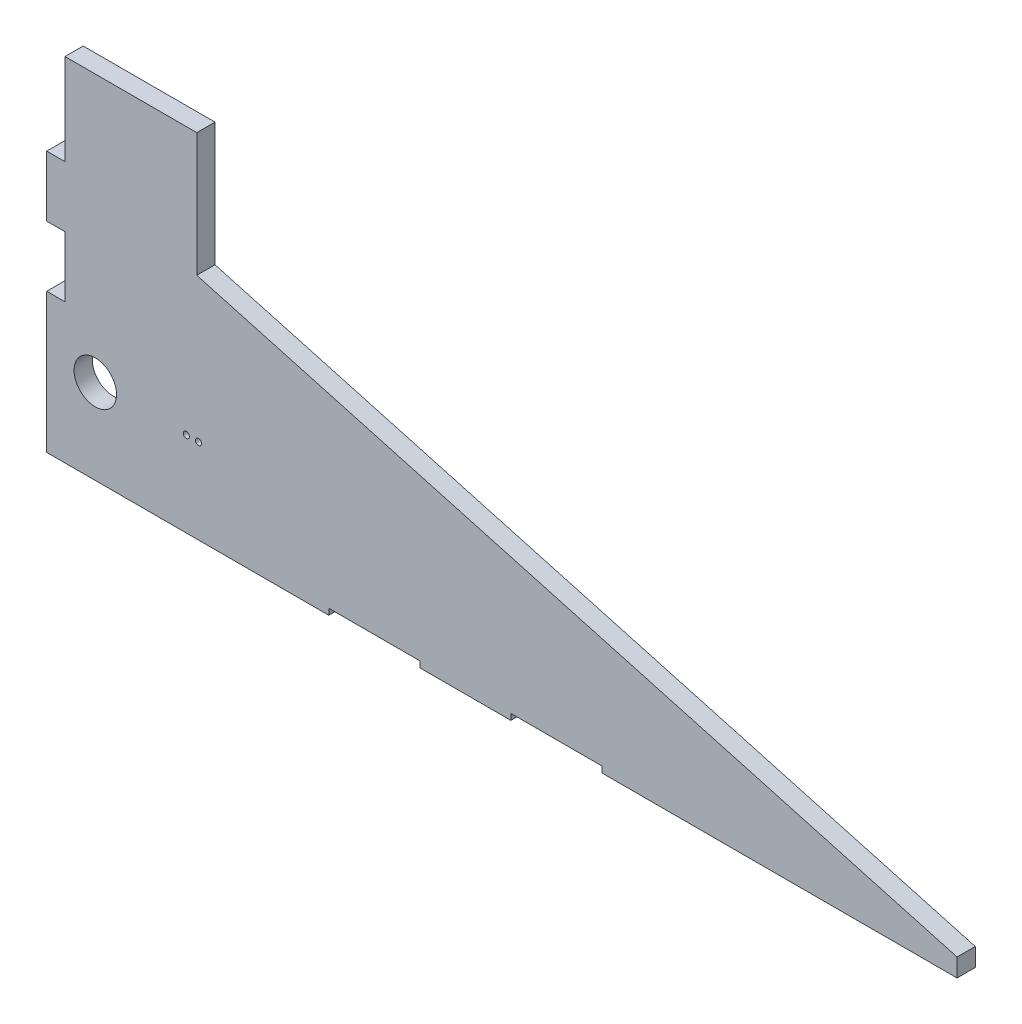
ISO-10303-21;
HEADER;
FILE_DESCRIPTION(('STEP AP214'),'2;1');
FILE_NAME('part.step','',(''),(''),'','','');
FILE_SCHEMA(('AUTOMOTIVE_DESIGN { 1 0 10303 214 1 1 1 1 }'));
ENDSEC;
DATA;
#1=APPLICATION_CONTEXT('core data for automotive mechanical design processes');
#2=APPLICATION_PROTOCOL_DEFINITION('international standard','automotive_design',2000,#1);
#3=PRODUCT_CONTEXT('',#1,'mechanical');
#4=PRODUCT('Part','Part','',(#3));
#5=PRODUCT_RELATED_PRODUCT_CATEGORY('part','',(#4));
#6=PRODUCT_DEFINITION_FORMATION('','',#4);
#7=PRODUCT_DEFINITION_CONTEXT('part definition',#1,'design');
#8=PRODUCT_DEFINITION('design','',#6,#7);
#9=PRODUCT_DEFINITION_SHAPE('','',#8);
#10=(LENGTH_UNIT() NAMED_UNIT(*) SI_UNIT(.MILLI.,.METRE.));
#11=(NAMED_UNIT(*) PLANE_ANGLE_UNIT() SI_UNIT($,.RADIAN.));
#12=(NAMED_UNIT(*) SI_UNIT($,.STERADIAN.) SOLID_ANGLE_UNIT());
#13=UNCERTAINTY_MEASURE_WITH_UNIT(LENGTH_MEASURE(1.E-05),#10,'distance_accuracy_value','');
#14=(GEOMETRIC_REPRESENTATION_CONTEXT(3) GLOBAL_UNCERTAINTY_ASSIGNED_CONTEXT((#13)) GLOBAL_UNIT_ASSIGNED_CONTEXT((#10,
#11,#12)) REPRESENTATION_CONTEXT('',''));
#15=CARTESIAN_POINT('',(0.,0.,0.));
#16=DIRECTION('',(0.,0.,1.));
#17=DIRECTION('',(1.,0.,0.));
#18=AXIS2_PLACEMENT_3D('',#15,#16,#17);
#19=CARTESIAN_POINT('',(0.,-59.0782122905028,0.5));
#20=DIRECTION('',(0.,1.,0.));
#21=DIRECTION('',(0.,0.,1.));
#22=AXIS2_PLACEMENT_3D('',#19,#20,#21);
#23=PLANE('',#22);
#24=DIRECTION('',(0.,0.,1.));
#25=VECTOR('',#24,1.);
#26=CARTESIAN_POINT('',(76.4737166857182,-59.0782122905028,-2.5));
#27=LINE('',#26,#25);
#28=CARTESIAN_POINT('',(76.4737166857182,-59.0782122905028,-2.5));
#29=VERTEX_POINT('',#28);
#30=CARTESIAN_POINT('',(76.4737166857182,-59.0782122905028,0.5));
#31=VERTEX_POINT('',#30);
#32=EDGE_CURVE('E188',#29,#31,#27,.T.);
#33=ORIENTED_EDGE('',*,*,#32,.T.);
#34=DIRECTION('',(1.,0.,0.));
#35=VECTOR('',#34,1.);
#36=CARTESIAN_POINT('',(0.,-59.0782122905028,0.5));
#37=LINE('',#36,#35);
#38=CARTESIAN_POINT('',(61.4737166857182,-59.0782122905028,0.5));
#39=VERTEX_POINT('',#38);
#40=EDGE_CURVE('E318',#39,#31,#37,.T.);
#41=ORIENTED_EDGE('',*,*,#40,.F.);
#42=DIRECTION('',(0.,0.,-1.));
#43=VECTOR('',#42,1.);
#44=CARTESIAN_POINT('',(61.4737166857182,-59.0782122905028,0.5));
#45=LINE('',#44,#43);
#46=CARTESIAN_POINT('',(61.4737166857182,-59.0782122905028,-2.5));
#47=VERTEX_POINT('',#46);
#48=EDGE_CURVE('E198',#39,#47,#45,.T.);
#49=ORIENTED_EDGE('',*,*,#48,.T.);
#50=DIRECTION('',(1.,0.,0.));
#51=VECTOR('',#50,1.);
#52=CARTESIAN_POINT('',(0.,-59.0782122905028,-2.5));
#53=LINE('',#52,#51);
#54=EDGE_CURVE('E299',#47,#29,#53,.T.);
#55=ORIENTED_EDGE('',*,*,#54,.T.);
#56=EDGE_LOOP('',(#33,#41,#49,#55));
#57=FACE_BOUND('',#56,.T.);
#58=ADVANCED_FACE('F34',(#57),#23,.F.);
#59=CARTESIAN_POINT('',(91.4737166857182,-59.0782122905028,0.5));
#60=VERTEX_POINT('',#59);
#61=CARTESIAN_POINT('',(150.,-59.0782122905028,0.5));
#62=VERTEX_POINT('',#61);
#63=EDGE_CURVE('E319',#60,#62,#37,.T.);
#64=ORIENTED_EDGE('',*,*,#63,.F.);
#65=DIRECTION('',(0.,0.,1.));
#66=VECTOR('',#65,1.);
#67=CARTESIAN_POINT('',(91.4737166857182,-59.0782122905028,-2.5));
#68=LINE('',#67,#66);
#69=CARTESIAN_POINT('',(91.4737166857182,-59.0782122905028,-2.5));
#70=VERTEX_POINT('',#69);
#71=EDGE_CURVE('E177',#70,#60,#68,.T.);
#72=ORIENTED_EDGE('',*,*,#71,.F.);
#73=CARTESIAN_POINT('',(150.,-59.0782122905028,-2.5));
#74=VERTEX_POINT('',#73);
#75=EDGE_CURVE('E294',#70,#74,#53,.T.);
#76=ORIENTED_EDGE('',*,*,#75,.T.);
#77=DIRECTION('',(0.,0.,-1.));
#78=VECTOR('',#77,1.);
#79=CARTESIAN_POINT('',(150.,-59.0782122905028,0.5));
#80=LINE('',#79,#78);
#81=EDGE_CURVE('E42',#62,#74,#80,.T.);
#82=ORIENTED_EDGE('',*,*,#81,.F.);
#83=EDGE_LOOP('',(#64,#72,#76,#82));
#84=FACE_BOUND('',#83,.T.);
#85=ADVANCED_FACE('F394',(#84),#23,.F.);
#86=CARTESIAN_POINT('',(0.,0.,0.5));
#87=DIRECTION('',(0.,0.,1.));
#88=DIRECTION('',(1.,0.,0.));
#89=AXIS2_PLACEMENT_3D('',#86,#87,#88);
#90=PLANE('',#89);
#91=DIRECTION('',(0.,-1.,0.));
#92=VECTOR('',#91,1.);
#93=CARTESIAN_POINT('',(91.4737166857182,-58.0782122905028,0.5));
#94=LINE('',#93,#92);
#95=CARTESIAN_POINT('',(91.4737166857182,-58.0782122905028,0.5));
#96=VERTEX_POINT('',#95);
#97=EDGE_CURVE('E171',#96,#60,#94,.T.);
#98=ORIENTED_EDGE('',*,*,#97,.T.);
#99=ORIENTED_EDGE('',*,*,#63,.T.);
#100=DIRECTION('',(0.,1.,0.));
#101=VECTOR('',#100,1.);
#102=CARTESIAN_POINT('',(150.,-59.0782122905028,0.5));
#103=LINE('',#102,#101);
#104=CARTESIAN_POINT('',(150.,-56.0782122905028,0.5));
#105=VERTEX_POINT('',#104);
#106=EDGE_CURVE('E317',#62,#105,#103,.T.);
#107=ORIENTED_EDGE('',*,*,#106,.T.);
#108=DIRECTION('',(-0.96382597398701,0.266532346757371,0.));
#109=VECTOR('',#108,1.);
#110=CARTESIAN_POINT('',(150.,-56.0782122905028,0.5));
#111=LINE('',#110,#109);
#112=CARTESIAN_POINT('',(24.7206703910615,-21.4339978554697,0.5));
#113=VERTEX_POINT('',#112);
#114=EDGE_CURVE('E321',#105,#113,#111,.T.);
#115=ORIENTED_EDGE('',*,*,#114,.T.);
#116=DIRECTION('',(0.,1.,0.));
#117=VECTOR('',#116,1.);
#118=CARTESIAN_POINT('',(24.7206703910615,-21.4339978554697,0.5));
#119=LINE('',#118,#117);
#120=CARTESIAN_POINT('',(24.7206703910615,-1.07821229050276,0.5));
#121=VERTEX_POINT('',#120);
#122=EDGE_CURVE('E323',#113,#121,#119,.T.);
#123=ORIENTED_EDGE('',*,*,#122,.T.);
#124=DIRECTION('',(-1.,0.,0.));
#125=VECTOR('',#124,1.);
#126=CARTESIAN_POINT('',(24.7206703910615,-1.07821229050276,0.5));
#127=LINE('',#126,#125);
#128=CARTESIAN_POINT('',(3.,-1.07821229050276,0.5));
#129=VERTEX_POINT('',#128);
#130=EDGE_CURVE('E308',#121,#129,#127,.T.);
#131=ORIENTED_EDGE('',*,*,#130,.T.);
#132=DIRECTION('',(0.,1.,0.));
#133=VECTOR('',#132,1.);
#134=CARTESIAN_POINT('',(3.,-1.07821229050276,0.5));
#135=LINE('',#134,#133);
#136=CARTESIAN_POINT('',(3.,-16.0782122905028,0.500000000000002));
#137=VERTEX_POINT('',#136);
#138=EDGE_CURVE('E231',#137,#129,#135,.T.);
#139=ORIENTED_EDGE('',*,*,#138,.F.);
#140=DIRECTION('',(-1.,0.,0.));
#141=VECTOR('',#140,1.);
#142=CARTESIAN_POINT('',(3.,-16.0782122905028,0.500000000000002));
#143=LINE('',#142,#141);
#144=CARTESIAN_POINT('',(0.,-16.0782122905028,0.500000000000002));
#145=VERTEX_POINT('',#144);
#146=EDGE_CURVE('E244',#137,#145,#143,.T.);
#147=ORIENTED_EDGE('',*,*,#146,.T.);
#148=DIRECTION('',(0.,-1.,0.));
#149=VECTOR('',#148,1.);
#150=CARTESIAN_POINT('',(0.,-1.07821229050276,0.5));
#151=LINE('',#150,#149);
#152=CARTESIAN_POINT('',(0.,-26.0782122905028,0.5));
#153=VERTEX_POINT('',#152);
#154=EDGE_CURVE('E313',#145,#153,#151,.T.);
#155=ORIENTED_EDGE('',*,*,#154,.T.);
#156=DIRECTION('',(-1.,0.,0.));
#157=VECTOR('',#156,1.);
#158=CARTESIAN_POINT('',(3.,-26.0782122905028,0.5));
#159=LINE('',#158,#157);
#160=CARTESIAN_POINT('',(3.,-26.0782122905028,0.5));
#161=VERTEX_POINT('',#160);
#162=EDGE_CURVE('E265',#161,#153,#159,.T.);
#163=ORIENTED_EDGE('',*,*,#162,.F.);
#164=DIRECTION('',(0.,1.,0.));
#165=VECTOR('',#164,1.);
#166=CARTESIAN_POINT('',(3.,-26.0782122905028,0.5));
#167=LINE('',#166,#165);
#168=CARTESIAN_POINT('',(3.,-36.0782122905028,0.5));
#169=VERTEX_POINT('',#168);
#170=EDGE_CURVE('E256',#169,#161,#167,.T.);
#171=ORIENTED_EDGE('',*,*,#170,.F.);
#172=DIRECTION('',(-1.,0.,0.));
#173=VECTOR('',#172,1.);
#174=CARTESIAN_POINT('',(3.,-36.0782122905028,0.5));
#175=LINE('',#174,#173);
#176=CARTESIAN_POINT('',(0.,-36.0782122905028,0.5));
#177=VERTEX_POINT('',#176);
#178=EDGE_CURVE('E267',#169,#177,#175,.T.);
#179=ORIENTED_EDGE('',*,*,#178,.T.);
#180=CARTESIAN_POINT('',(0.,-59.0782122905028,0.5));
#181=VERTEX_POINT('',#180);
#182=EDGE_CURVE('E311',#177,#181,#151,.T.);
#183=ORIENTED_EDGE('',*,*,#182,.T.);
#184=CARTESIAN_POINT('',(46.4737166857182,-59.0782122905028,0.5));
#185=VERTEX_POINT('',#184);
#186=EDGE_CURVE('E314',#181,#185,#37,.T.);
#187=ORIENTED_EDGE('',*,*,#186,.T.);
#188=DIRECTION('',(0.,-1.,0.));
#189=VECTOR('',#188,1.);
#190=CARTESIAN_POINT('',(46.4737166857182,-58.0782122905028,0.5));
#191=LINE('',#190,#189);
#192=CARTESIAN_POINT('',(46.4737166857182,-58.0782122905028,0.5));
#193=VERTEX_POINT('',#192);
#194=EDGE_CURVE('E213',#193,#185,#191,.T.);
#195=ORIENTED_EDGE('',*,*,#194,.F.);
#196=DIRECTION('',(-1.,0.,0.));
#197=VECTOR('',#196,1.);
#198=CARTESIAN_POINT('',(61.4737166857182,-58.0782122905028,0.5));
#199=LINE('',#198,#197);
#200=CARTESIAN_POINT('',(61.4737166857182,-58.0782122905028,0.5));
#201=VERTEX_POINT('',#200);
#202=EDGE_CURVE('E218',#201,#193,#199,.T.);
#203=ORIENTED_EDGE('',*,*,#202,.F.);
#204=DIRECTION('',(0.,-1.,0.));
#205=VECTOR('',#204,1.);
#206=CARTESIAN_POINT('',(61.4737166857182,-58.0782122905028,0.5));
#207=LINE('',#206,#205);
#208=EDGE_CURVE('E215',#201,#39,#207,.T.);
#209=ORIENTED_EDGE('',*,*,#208,.T.);
#210=ORIENTED_EDGE('',*,*,#40,.T.);
#211=DIRECTION('',(0.,-1.,0.));
#212=VECTOR('',#211,1.);
#213=CARTESIAN_POINT('',(76.4737166857182,-58.0782122905028,0.5));
#214=LINE('',#213,#212);
#215=CARTESIAN_POINT('',(76.4737166857182,-58.0782122905028,0.5));
#216=VERTEX_POINT('',#215);
#217=EDGE_CURVE('E181',#216,#31,#214,.T.);
#218=ORIENTED_EDGE('',*,*,#217,.F.);
#219=DIRECTION('',(-1.,0.,0.));
#220=VECTOR('',#219,1.);
#221=CARTESIAN_POINT('',(91.4737166857182,-58.0782122905028,0.5));
#222=LINE('',#221,#220);
#223=EDGE_CURVE('E185',#96,#216,#222,.T.);
#224=ORIENTED_EDGE('',*,*,#223,.F.);
#225=EDGE_LOOP('',(#98,#99,#107,#115,#123,#131,#139,#147,#155,#163,#171,#179,#183,#187,#195,
#203,#209,#210,#218,#224));
#226=FACE_BOUND('',#225,.T.);
#227=CARTESIAN_POINT('',(8.,-45.0782122905028,0.5));
#228=DIRECTION('',(0.,0.,1.));
#229=DIRECTION('',(1.,0.,0.));
#230=AXIS2_PLACEMENT_3D('',#227,#228,#229);
#231=CIRCLE('',#230,3.5);
#232=CARTESIAN_POINT('',(11.5,-45.0782122905028,0.5));
#233=VERTEX_POINT('',#232);
#234=EDGE_CURVE('E273',#233,#233,#231,.T.);
#235=ORIENTED_EDGE('',*,*,#234,.F.);
#236=EDGE_LOOP('',(#235));
#237=FACE_BOUND('',#236,.T.);
#238=CARTESIAN_POINT('',(25.,-45.0782122905028,0.5));
#239=DIRECTION('',(0.,0.,1.));
#240=DIRECTION('',(1.,0.,0.));
#241=AXIS2_PLACEMENT_3D('',#238,#239,#240);
#242=CIRCLE('',#241,0.499999999999999);
#243=CARTESIAN_POINT('',(25.5,-45.0782122905028,0.5));
#244=VERTEX_POINT('',#243);
#245=EDGE_CURVE('E277',#244,#244,#242,.T.);
#246=ORIENTED_EDGE('',*,*,#245,.F.);
#247=EDGE_LOOP('',(#246));
#248=FACE_BOUND('',#247,.T.);
#249=CARTESIAN_POINT('',(23.,-45.0782122905028,0.5));
#250=DIRECTION('',(0.,0.,1.));
#251=DIRECTION('',(1.,0.,0.));
#252=AXIS2_PLACEMENT_3D('',#249,#250,#251);
#253=CIRCLE('',#252,0.499999999999999);
#254=CARTESIAN_POINT('',(23.5,-45.0782122905028,0.5));
#255=VERTEX_POINT('',#254);
#256=EDGE_CURVE('E280',#255,#255,#253,.T.);
#257=ORIENTED_EDGE('',*,*,#256,.F.);
#258=EDGE_LOOP('',(#257));
#259=FACE_BOUND('',#258,.T.);
#260=ADVANCED_FACE('F190',(#226,#237,#248,#259),#90,.T.);
#261=CARTESIAN_POINT('',(0.,0.,-2.5));
#262=DIRECTION('',(0.,0.,1.));
#263=DIRECTION('',(1.,0.,0.));
#264=AXIS2_PLACEMENT_3D('',#261,#262,#263);
#265=PLANE('',#264);
#266=CARTESIAN_POINT('',(23.,-45.0782122905028,-2.5));
#267=DIRECTION('',(0.,0.,1.));
#268=DIRECTION('',(1.,0.,0.));
#269=AXIS2_PLACEMENT_3D('',#266,#267,#268);
#270=CIRCLE('',#269,0.499999999999999);
#271=CARTESIAN_POINT('',(23.5,-45.0782122905028,-2.5));
#272=VERTEX_POINT('',#271);
#273=EDGE_CURVE('E276',#272,#272,#270,.T.);
#274=ORIENTED_EDGE('',*,*,#273,.T.);
#275=EDGE_LOOP('',(#274));
#276=FACE_BOUND('',#275,.T.);
#277=CARTESIAN_POINT('',(25.,-45.0782122905028,-2.5));
#278=DIRECTION('',(0.,0.,1.));
#279=DIRECTION('',(1.,0.,0.));
#280=AXIS2_PLACEMENT_3D('',#277,#278,#279);
#281=CIRCLE('',#280,0.499999999999999);
#282=CARTESIAN_POINT('',(25.5,-45.0782122905028,-2.5));
#283=VERTEX_POINT('',#282);
#284=EDGE_CURVE('E285',#283,#283,#281,.T.);
#285=ORIENTED_EDGE('',*,*,#284,.T.);
#286=EDGE_LOOP('',(#285));
#287=FACE_BOUND('',#286,.T.);
#288=CARTESIAN_POINT('',(8.,-45.0782122905028,-2.5));
#289=DIRECTION('',(0.,0.,1.));
#290=DIRECTION('',(1.,0.,0.));
#291=AXIS2_PLACEMENT_3D('',#288,#289,#290);
#292=CIRCLE('',#291,3.5);
#293=CARTESIAN_POINT('',(11.5,-45.0782122905028,-2.5));
#294=VERTEX_POINT('',#293);
#295=EDGE_CURVE('E288',#294,#294,#292,.T.);
#296=ORIENTED_EDGE('',*,*,#295,.T.);
#297=EDGE_LOOP('',(#296));
#298=FACE_BOUND('',#297,.T.);
#299=ORIENTED_EDGE('',*,*,#75,.F.);
#300=DIRECTION('',(0.,-1.,0.));
#301=VECTOR('',#300,1.);
#302=CARTESIAN_POINT('',(91.4737166857182,-58.0782122905028,-2.5));
#303=LINE('',#302,#301);
#304=CARTESIAN_POINT('',(91.4737166857182,-58.0782122905028,-2.5));
#305=VERTEX_POINT('',#304);
#306=EDGE_CURVE('E201',#305,#70,#303,.T.);
#307=ORIENTED_EDGE('',*,*,#306,.F.);
#308=DIRECTION('',(-1.,0.,0.));
#309=VECTOR('',#308,1.);
#310=CARTESIAN_POINT('',(91.4737166857182,-58.0782122905028,-2.5));
#311=LINE('',#310,#309);
#312=CARTESIAN_POINT('',(76.4737166857182,-58.0782122905028,-2.5));
#313=VERTEX_POINT('',#312);
#314=EDGE_CURVE('E182',#305,#313,#311,.T.);
#315=ORIENTED_EDGE('',*,*,#314,.T.);
#316=DIRECTION('',(0.,-1.,0.));
#317=VECTOR('',#316,1.);
#318=CARTESIAN_POINT('',(76.4737166857182,-58.0782122905028,-2.5));
#319=LINE('',#318,#317);
#320=EDGE_CURVE('E204',#313,#29,#319,.T.);
#321=ORIENTED_EDGE('',*,*,#320,.T.);
#322=ORIENTED_EDGE('',*,*,#54,.F.);
#323=DIRECTION('',(0.,-1.,0.));
#324=VECTOR('',#323,1.);
#325=CARTESIAN_POINT('',(61.4737166857182,-58.0782122905028,-2.5));
#326=LINE('',#325,#324);
#327=CARTESIAN_POINT('',(61.4737166857182,-58.0782122905028,-2.5));
#328=VERTEX_POINT('',#327);
#329=EDGE_CURVE('E208',#328,#47,#326,.T.);
#330=ORIENTED_EDGE('',*,*,#329,.F.);
#331=DIRECTION('',(-1.,0.,0.));
#332=VECTOR('',#331,1.);
#333=CARTESIAN_POINT('',(61.4737166857182,-58.0782122905028,-2.5));
#334=LINE('',#333,#332);
#335=CARTESIAN_POINT('',(46.4737166857182,-58.0782122905028,-2.5));
#336=VERTEX_POINT('',#335);
#337=EDGE_CURVE('E226',#328,#336,#334,.T.);
#338=ORIENTED_EDGE('',*,*,#337,.T.);
#339=DIRECTION('',(0.,-1.,0.));
#340=VECTOR('',#339,1.);
#341=CARTESIAN_POINT('',(46.4737166857182,-58.0782122905028,-2.5));
#342=LINE('',#341,#340);
#343=CARTESIAN_POINT('',(46.4737166857182,-59.0782122905028,-2.5));
#344=VERTEX_POINT('',#343);
#345=EDGE_CURVE('E210',#336,#344,#342,.T.);
#346=ORIENTED_EDGE('',*,*,#345,.T.);
#347=CARTESIAN_POINT('',(0.,-59.0782122905028,-2.5));
#348=VERTEX_POINT('',#347);
#349=EDGE_CURVE('E295',#348,#344,#53,.T.);
#350=ORIENTED_EDGE('',*,*,#349,.F.);
#351=DIRECTION('',(0.,-1.,0.));
#352=VECTOR('',#351,1.);
#353=CARTESIAN_POINT('',(0.,-1.07821229050276,-2.5));
#354=LINE('',#353,#352);
#355=CARTESIAN_POINT('',(0.,-36.0782122905028,-2.49999999999999));
#356=VERTEX_POINT('',#355);
#357=EDGE_CURVE('E247',#356,#348,#354,.T.);
#358=ORIENTED_EDGE('',*,*,#357,.F.);
#359=DIRECTION('',(-1.,0.,0.));
#360=VECTOR('',#359,1.);
#361=CARTESIAN_POINT('',(3.,-36.0782122905028,-2.49999999999999));
#362=LINE('',#361,#360);
#363=CARTESIAN_POINT('',(3.,-36.0782122905028,-2.49999999999999));
#364=VERTEX_POINT('',#363);
#365=EDGE_CURVE('E260',#364,#356,#362,.T.);
#366=ORIENTED_EDGE('',*,*,#365,.F.);
#367=DIRECTION('',(0.,-1.,0.));
#368=VECTOR('',#367,1.);
#369=CARTESIAN_POINT('',(3.,-26.0782122905028,-2.5));
#370=LINE('',#369,#368);
#371=CARTESIAN_POINT('',(3.,-26.0782122905028,-2.5));
#372=VERTEX_POINT('',#371);
#373=EDGE_CURVE('E249',#372,#364,#370,.T.);
#374=ORIENTED_EDGE('',*,*,#373,.F.);
#375=DIRECTION('',(-1.,0.,0.));
#376=VECTOR('',#375,1.);
#377=CARTESIAN_POINT('',(3.,-26.0782122905028,-2.5));
#378=LINE('',#377,#376);
#379=CARTESIAN_POINT('',(0.,-26.0782122905028,-2.5));
#380=VERTEX_POINT('',#379);
#381=EDGE_CURVE('E243',#372,#380,#378,.T.);
#382=ORIENTED_EDGE('',*,*,#381,.T.);
#383=CARTESIAN_POINT('',(0.,-16.0782122905028,-2.5));
#384=VERTEX_POINT('',#383);
#385=EDGE_CURVE('E272',#384,#380,#354,.T.);
#386=ORIENTED_EDGE('',*,*,#385,.F.);
#387=DIRECTION('',(-1.,0.,0.));
#388=VECTOR('',#387,1.);
#389=CARTESIAN_POINT('',(3.,-16.0782122905028,-2.5));
#390=LINE('',#389,#388);
#391=CARTESIAN_POINT('',(3.,-16.0782122905028,-2.5));
#392=VERTEX_POINT('',#391);
#393=EDGE_CURVE('E241',#392,#384,#390,.T.);
#394=ORIENTED_EDGE('',*,*,#393,.F.);
#395=DIRECTION('',(0.,-1.,0.));
#396=VECTOR('',#395,1.);
#397=CARTESIAN_POINT('',(3.,-1.07821229050276,-2.5));
#398=LINE('',#397,#396);
#399=CARTESIAN_POINT('',(3.,-1.07821229050276,-2.5));
#400=VERTEX_POINT('',#399);
#401=EDGE_CURVE('E236',#400,#392,#398,.T.);
#402=ORIENTED_EDGE('',*,*,#401,.F.);
#403=DIRECTION('',(-1.,0.,0.));
#404=VECTOR('',#403,1.);
#405=CARTESIAN_POINT('',(24.7206703910615,-1.07821229050276,-2.5));
#406=LINE('',#405,#404);
#407=CARTESIAN_POINT('',(24.7206703910615,-1.07821229050276,-2.5));
#408=VERTEX_POINT('',#407);
#409=EDGE_CURVE('E291',#408,#400,#406,.T.);
#410=ORIENTED_EDGE('',*,*,#409,.F.);
#411=DIRECTION('',(0.,1.,0.));
#412=VECTOR('',#411,1.);
#413=CARTESIAN_POINT('',(24.7206703910615,-21.4339978554697,-2.5));
#414=LINE('',#413,#412);
#415=CARTESIAN_POINT('',(24.7206703910615,-21.4339978554697,-2.5));
#416=VERTEX_POINT('',#415);
#417=EDGE_CURVE('E305',#416,#408,#414,.T.);
#418=ORIENTED_EDGE('',*,*,#417,.F.);
#419=DIRECTION('',(-0.96382597398701,0.266532346757371,0.));
#420=VECTOR('',#419,1.);
#421=CARTESIAN_POINT('',(150.,-56.0782122905028,-2.5));
#422=LINE('',#421,#420);
#423=CARTESIAN_POINT('',(150.,-56.0782122905028,-2.5));
#424=VERTEX_POINT('',#423);
#425=EDGE_CURVE('E302',#424,#416,#422,.T.);
#426=ORIENTED_EDGE('',*,*,#425,.F.);
#427=DIRECTION('',(0.,1.,0.));
#428=VECTOR('',#427,1.);
#429=CARTESIAN_POINT('',(150.,-59.0782122905028,-2.5));
#430=LINE('',#429,#428);
#431=EDGE_CURVE('E298',#74,#424,#430,.T.);
#432=ORIENTED_EDGE('',*,*,#431,.F.);
#433=EDGE_LOOP('',(#299,#307,#315,#321,#322,#330,#338,#346,#350,#358,#366,#374,#382,#386,#394,
#402,#410,#418,#426,#432));
#434=FACE_BOUND('',#433,.T.);
#435=ADVANCED_FACE('F341',(#276,#287,#298,#434),#265,.F.);
#436=CARTESIAN_POINT('',(0.,-1.07821229050276,0.5));
#437=DIRECTION('',(1.,0.,0.));
#438=DIRECTION('',(0.,1.,0.));
#439=AXIS2_PLACEMENT_3D('',#436,#437,#438);
#440=PLANE('',#439);
#441=ORIENTED_EDGE('',*,*,#154,.F.);
#442=DIRECTION('',(0.,0.,1.));
#443=VECTOR('',#442,1.);
#444=CARTESIAN_POINT('',(0.,-16.0782122905028,0.500000000000002));
#445=LINE('',#444,#443);
#446=EDGE_CURVE('E234',#384,#145,#445,.T.);
#447=ORIENTED_EDGE('',*,*,#446,.F.);
#448=ORIENTED_EDGE('',*,*,#385,.T.);
#449=DIRECTION('',(0.,0.,-1.));
#450=VECTOR('',#449,1.);
#451=CARTESIAN_POINT('',(0.,-26.0782122905028,-2.5));
#452=LINE('',#451,#450);
#453=EDGE_CURVE('E253',#153,#380,#452,.T.);
#454=ORIENTED_EDGE('',*,*,#453,.F.);
#455=EDGE_LOOP('',(#441,#447,#448,#454));
#456=FACE_BOUND('',#455,.T.);
#457=ADVANCED_FACE('F358',(#456),#440,.F.);
#458=CARTESIAN_POINT('',(24.7206703910615,-1.07821229050276,0.5));
#459=DIRECTION('',(0.,-1.,0.));
#460=DIRECTION('',(1.,0.,0.));
#461=AXIS2_PLACEMENT_3D('',#458,#459,#460);
#462=PLANE('',#461);
#463=ORIENTED_EDGE('',*,*,#409,.T.);
#464=DIRECTION('',(0.,0.,-1.));
#465=VECTOR('',#464,1.);
#466=CARTESIAN_POINT('',(3.,-1.07821229050276,0.5));
#467=LINE('',#466,#465);
#468=EDGE_CURVE('E233',#129,#400,#467,.T.);
#469=ORIENTED_EDGE('',*,*,#468,.F.);
#470=ORIENTED_EDGE('',*,*,#130,.F.);
#471=DIRECTION('',(0.,0.,-1.));
#472=VECTOR('',#471,1.);
#473=CARTESIAN_POINT('',(24.7206703910615,-1.07821229050276,0.5));
#474=LINE('',#473,#472);
#475=EDGE_CURVE('E325',#121,#408,#474,.T.);
#476=ORIENTED_EDGE('',*,*,#475,.T.);
#477=EDGE_LOOP('',(#463,#469,#470,#476));
#478=FACE_BOUND('',#477,.T.);
#479=ADVANCED_FACE('F36',(#478),#462,.F.);
#480=ORIENTED_EDGE('',*,*,#182,.F.);
#481=DIRECTION('',(0.,0.,1.));
#482=VECTOR('',#481,1.);
#483=CARTESIAN_POINT('',(0.,-36.0782122905028,-2.49999999999999));
#484=LINE('',#483,#482);
#485=EDGE_CURVE('E203',#356,#177,#484,.T.);
#486=ORIENTED_EDGE('',*,*,#485,.F.);
#487=ORIENTED_EDGE('',*,*,#357,.T.);
#488=DIRECTION('',(0.,0.,-1.));
#489=VECTOR('',#488,1.);
#490=CARTESIAN_POINT('',(0.,-59.0782122905028,0.5));
#491=LINE('',#490,#489);
#492=EDGE_CURVE('E11',#181,#348,#491,.T.);
#493=ORIENTED_EDGE('',*,*,#492,.F.);
#494=EDGE_LOOP('',(#480,#486,#487,#493));
#495=FACE_BOUND('',#494,.T.);
#496=ADVANCED_FACE('F376',(#495),#440,.F.);
#497=ORIENTED_EDGE('',*,*,#349,.T.);
#498=DIRECTION('',(0.,0.,-1.));
#499=VECTOR('',#498,1.);
#500=CARTESIAN_POINT('',(46.4737166857182,-59.0782122905028,0.5));
#501=LINE('',#500,#499);
#502=EDGE_CURVE('E219',#185,#344,#501,.T.);
#503=ORIENTED_EDGE('',*,*,#502,.F.);
#504=ORIENTED_EDGE('',*,*,#186,.F.);
#505=ORIENTED_EDGE('',*,*,#492,.T.);
#506=EDGE_LOOP('',(#497,#503,#504,#505));
#507=FACE_BOUND('',#506,.T.);
#508=ADVANCED_FACE('F381',(#507),#23,.F.);
#509=CARTESIAN_POINT('',(150.,-59.0782122905028,0.5));
#510=DIRECTION('',(-1.,0.,0.));
#511=DIRECTION('',(0.,0.,1.));
#512=AXIS2_PLACEMENT_3D('',#509,#510,#511);
#513=PLANE('',#512);
#514=ORIENTED_EDGE('',*,*,#81,.T.);
#515=ORIENTED_EDGE('',*,*,#431,.T.);
#516=DIRECTION('',(0.,0.,-1.));
#517=VECTOR('',#516,1.);
#518=CARTESIAN_POINT('',(150.,-56.0782122905028,0.5));
#519=LINE('',#518,#517);
#520=EDGE_CURVE('E329',#105,#424,#519,.T.);
#521=ORIENTED_EDGE('',*,*,#520,.F.);
#522=ORIENTED_EDGE('',*,*,#106,.F.);
#523=EDGE_LOOP('',(#514,#515,#521,#522));
#524=FACE_BOUND('',#523,.T.);
#525=ADVANCED_FACE('F335',(#524),#513,.F.);
#526=CARTESIAN_POINT('',(150.,-56.0782122905028,0.5));
#527=DIRECTION('',(-0.266532346757371,-0.96382597398701,0.));
#528=DIRECTION('',(0.96382597398701,-0.266532346757371,0.));
#529=AXIS2_PLACEMENT_3D('',#526,#527,#528);
#530=PLANE('',#529);
#531=ORIENTED_EDGE('',*,*,#520,.T.);
#532=ORIENTED_EDGE('',*,*,#425,.T.);
#533=DIRECTION('',(0.,0.,-1.));
#534=VECTOR('',#533,1.);
#535=CARTESIAN_POINT('',(24.7206703910615,-21.4339978554697,0.5));
#536=LINE('',#535,#534);
#537=EDGE_CURVE('E327',#113,#416,#536,.T.);
#538=ORIENTED_EDGE('',*,*,#537,.F.);
#539=ORIENTED_EDGE('',*,*,#114,.F.);
#540=EDGE_LOOP('',(#531,#532,#538,#539));
#541=FACE_BOUND('',#540,.T.);
#542=ADVANCED_FACE('F346',(#541),#530,.F.);
#543=CARTESIAN_POINT('',(24.7206703910615,-21.4339978554697,0.5));
#544=DIRECTION('',(-1.,0.,0.));
#545=DIRECTION('',(0.,0.,1.));
#546=AXIS2_PLACEMENT_3D('',#543,#544,#545);
#547=PLANE('',#546);
#548=ORIENTED_EDGE('',*,*,#537,.T.);
#549=ORIENTED_EDGE('',*,*,#417,.T.);
#550=ORIENTED_EDGE('',*,*,#475,.F.);
#551=ORIENTED_EDGE('',*,*,#122,.F.);
#552=EDGE_LOOP('',(#548,#549,#550,#551));
#553=FACE_BOUND('',#552,.T.);
#554=ADVANCED_FACE('F425',(#553),#547,.F.);
#555=CARTESIAN_POINT('',(23.,-45.0782122905028,-243.5));
#556=DIRECTION('',(0.,0.,1.));
#557=DIRECTION('',(1.,0.,0.));
#558=AXIS2_PLACEMENT_3D('',#555,#556,#557);
#559=CYLINDRICAL_SURFACE('',#558,0.499999999999999);
#560=ORIENTED_EDGE('',*,*,#256,.T.);
#561=EDGE_LOOP('',(#560));
#562=FACE_BOUND('',#561,.T.);
#563=ORIENTED_EDGE('',*,*,#273,.F.);
#564=EDGE_LOOP('',(#563));
#565=FACE_BOUND('',#564,.T.);
#566=ADVANCED_FACE('F422',(#562,#565),#559,.F.);
#567=CARTESIAN_POINT('',(25.,-45.0782122905028,-243.5));
#568=DIRECTION('',(0.,0.,1.));
#569=DIRECTION('',(1.,0.,0.));
#570=AXIS2_PLACEMENT_3D('',#567,#568,#569);
#571=CYLINDRICAL_SURFACE('',#570,0.499999999999999);
#572=ORIENTED_EDGE('',*,*,#245,.T.);
#573=EDGE_LOOP('',(#572));
#574=FACE_BOUND('',#573,.T.);
#575=ORIENTED_EDGE('',*,*,#284,.F.);
#576=EDGE_LOOP('',(#575));
#577=FACE_BOUND('',#576,.T.);
#578=ADVANCED_FACE('F444',(#574,#577),#571,.F.);
#579=CARTESIAN_POINT('',(8.,-45.0782122905028,-243.5));
#580=DIRECTION('',(0.,0.,1.));
#581=DIRECTION('',(1.,0.,0.));
#582=AXIS2_PLACEMENT_3D('',#579,#580,#581);
#583=CYLINDRICAL_SURFACE('',#582,3.5);
#584=ORIENTED_EDGE('',*,*,#234,.T.);
#585=EDGE_LOOP('',(#584));
#586=FACE_BOUND('',#585,.T.);
#587=ORIENTED_EDGE('',*,*,#295,.F.);
#588=EDGE_LOOP('',(#587));
#589=FACE_BOUND('',#588,.T.);
#590=ADVANCED_FACE('F451',(#586,#589),#583,.F.);
#591=CARTESIAN_POINT('',(3.,-26.0782122905028,-2.5));
#592=DIRECTION('',(0.,1.,0.));
#593=DIRECTION('',(-1.,0.,0.));
#594=AXIS2_PLACEMENT_3D('',#591,#592,#593);
#595=PLANE('',#594);
#596=ORIENTED_EDGE('',*,*,#453,.T.);
#597=ORIENTED_EDGE('',*,*,#381,.F.);
#598=DIRECTION('',(0.,0.,-1.));
#599=VECTOR('',#598,1.);
#600=CARTESIAN_POINT('',(3.,-26.0782122905028,-2.5));
#601=LINE('',#600,#599);
#602=EDGE_CURVE('E258',#161,#372,#601,.T.);
#603=ORIENTED_EDGE('',*,*,#602,.F.);
#604=ORIENTED_EDGE('',*,*,#162,.T.);
#605=EDGE_LOOP('',(#596,#597,#603,#604));
#606=FACE_BOUND('',#605,.T.);
#607=ADVANCED_FACE('F363',(#606),#595,.F.);
#608=CARTESIAN_POINT('',(3.,-36.0782122905028,-2.49999999999999));
#609=DIRECTION('',(0.,-1.,0.));
#610=DIRECTION('',(1.,0.,0.));
#611=AXIS2_PLACEMENT_3D('',#608,#609,#610);
#612=PLANE('',#611);
#613=ORIENTED_EDGE('',*,*,#485,.T.);
#614=ORIENTED_EDGE('',*,*,#178,.F.);
#615=DIRECTION('',(0.,0.,1.));
#616=VECTOR('',#615,1.);
#617=CARTESIAN_POINT('',(3.,-36.0782122905028,-2.49999999999999));
#618=LINE('',#617,#616);
#619=EDGE_CURVE('E252',#364,#169,#618,.T.);
#620=ORIENTED_EDGE('',*,*,#619,.F.);
#621=ORIENTED_EDGE('',*,*,#365,.T.);
#622=EDGE_LOOP('',(#613,#614,#620,#621));
#623=FACE_BOUND('',#622,.T.);
#624=ADVANCED_FACE('F465',(#623),#612,.F.);
#625=CARTESIAN_POINT('',(3.,0.,0.));
#626=DIRECTION('',(-1.,0.,0.));
#627=DIRECTION('',(0.,-1.,0.));
#628=AXIS2_PLACEMENT_3D('',#625,#626,#627);
#629=PLANE('',#628);
#630=ORIENTED_EDGE('',*,*,#373,.T.);
#631=ORIENTED_EDGE('',*,*,#619,.T.);
#632=ORIENTED_EDGE('',*,*,#170,.T.);
#633=ORIENTED_EDGE('',*,*,#602,.T.);
#634=EDGE_LOOP('',(#630,#631,#632,#633));
#635=FACE_BOUND('',#634,.T.);
#636=ADVANCED_FACE('F370',(#635),#629,.T.);
#637=CARTESIAN_POINT('',(3.,-16.0782122905028,0.500000000000002));
#638=DIRECTION('',(0.,-1.,0.));
#639=DIRECTION('',(1.,0.,0.));
#640=AXIS2_PLACEMENT_3D('',#637,#638,#639);
#641=PLANE('',#640);
#642=ORIENTED_EDGE('',*,*,#446,.T.);
#643=ORIENTED_EDGE('',*,*,#146,.F.);
#644=DIRECTION('',(0.,0.,1.));
#645=VECTOR('',#644,1.);
#646=CARTESIAN_POINT('',(3.,-16.0782122905028,0.500000000000002));
#647=LINE('',#646,#645);
#648=EDGE_CURVE('E238',#392,#137,#647,.T.);
#649=ORIENTED_EDGE('',*,*,#648,.F.);
#650=ORIENTED_EDGE('',*,*,#393,.T.);
#651=EDGE_LOOP('',(#642,#643,#649,#650));
#652=FACE_BOUND('',#651,.T.);
#653=ADVANCED_FACE('F478',(#652),#641,.F.);
#654=CARTESIAN_POINT('',(3.,0.,0.));
#655=DIRECTION('',(1.,0.,0.));
#656=DIRECTION('',(0.,1.,0.));
#657=AXIS2_PLACEMENT_3D('',#654,#655,#656);
#658=PLANE('',#657);
#659=ORIENTED_EDGE('',*,*,#138,.T.);
#660=ORIENTED_EDGE('',*,*,#468,.T.);
#661=ORIENTED_EDGE('',*,*,#401,.T.);
#662=ORIENTED_EDGE('',*,*,#648,.T.);
#663=EDGE_LOOP('',(#659,#660,#661,#662));
#664=FACE_BOUND('',#663,.T.);
#665=ADVANCED_FACE('F485',(#664),#658,.F.);
#666=CARTESIAN_POINT('',(61.4737166857182,-58.0782122905028,0.5));
#667=DIRECTION('',(-1.,0.,0.));
#668=DIRECTION('',(0.,0.,1.));
#669=AXIS2_PLACEMENT_3D('',#666,#667,#668);
#670=PLANE('',#669);
#671=ORIENTED_EDGE('',*,*,#48,.F.);
#672=ORIENTED_EDGE('',*,*,#208,.F.);
#673=DIRECTION('',(0.,0.,-1.));
#674=VECTOR('',#673,1.);
#675=CARTESIAN_POINT('',(61.4737166857182,-58.0782122905028,0.5));
#676=LINE('',#675,#674);
#677=EDGE_CURVE('E221',#201,#328,#676,.T.);
#678=ORIENTED_EDGE('',*,*,#677,.T.);
#679=ORIENTED_EDGE('',*,*,#329,.T.);
#680=EDGE_LOOP('',(#671,#672,#678,#679));
#681=FACE_BOUND('',#680,.T.);
#682=ADVANCED_FACE('F390',(#681),#670,.T.);
#683=CARTESIAN_POINT('',(46.4737166857182,-58.0782122905028,0.5));
#684=DIRECTION('',(-1.,0.,0.));
#685=DIRECTION('',(0.,0.,1.));
#686=AXIS2_PLACEMENT_3D('',#683,#684,#685);
#687=PLANE('',#686);
#688=ORIENTED_EDGE('',*,*,#502,.T.);
#689=ORIENTED_EDGE('',*,*,#345,.F.);
#690=DIRECTION('',(0.,0.,-1.));
#691=VECTOR('',#690,1.);
#692=CARTESIAN_POINT('',(46.4737166857182,-58.0782122905028,0.5));
#693=LINE('',#692,#691);
#694=EDGE_CURVE('E57',#193,#336,#693,.T.);
#695=ORIENTED_EDGE('',*,*,#694,.F.);
#696=ORIENTED_EDGE('',*,*,#194,.T.);
#697=EDGE_LOOP('',(#688,#689,#695,#696));
#698=FACE_BOUND('',#697,.T.);
#699=ADVANCED_FACE('F385',(#698),#687,.F.);
#700=CARTESIAN_POINT('',(0.,-58.0782122905028,0.));
#701=DIRECTION('',(0.,1.,0.));
#702=DIRECTION('',(0.,0.,1.));
#703=AXIS2_PLACEMENT_3D('',#700,#701,#702);
#704=PLANE('',#703);
#705=ORIENTED_EDGE('',*,*,#677,.F.);
#706=ORIENTED_EDGE('',*,*,#202,.T.);
#707=ORIENTED_EDGE('',*,*,#694,.T.);
#708=ORIENTED_EDGE('',*,*,#337,.F.);
#709=EDGE_LOOP('',(#705,#706,#707,#708));
#710=FACE_BOUND('',#709,.T.);
#711=ADVANCED_FACE('F387',(#710),#704,.F.);
#712=CARTESIAN_POINT('',(91.4737166857182,-58.0782122905028,-2.5));
#713=DIRECTION('',(1.,0.,0.));
#714=DIRECTION('',(0.,0.,-1.));
#715=AXIS2_PLACEMENT_3D('',#712,#713,#714);
#716=PLANE('',#715);
#717=ORIENTED_EDGE('',*,*,#71,.T.);
#718=ORIENTED_EDGE('',*,*,#97,.F.);
#719=DIRECTION('',(0.,0.,1.));
#720=VECTOR('',#719,1.);
#721=CARTESIAN_POINT('',(91.4737166857182,-58.0782122905028,-2.5));
#722=LINE('',#721,#720);
#723=EDGE_CURVE('E174',#305,#96,#722,.T.);
#724=ORIENTED_EDGE('',*,*,#723,.F.);
#725=ORIENTED_EDGE('',*,*,#306,.T.);
#726=EDGE_LOOP('',(#717,#718,#724,#725));
#727=FACE_BOUND('',#726,.T.);
#728=ADVANCED_FACE('F173',(#727),#716,.F.);
#729=CARTESIAN_POINT('',(76.4737166857182,-58.0782122905028,-2.5));
#730=DIRECTION('',(1.,0.,0.));
#731=DIRECTION('',(0.,0.,-1.));
#732=AXIS2_PLACEMENT_3D('',#729,#730,#731);
#733=PLANE('',#732);
#734=ORIENTED_EDGE('',*,*,#32,.F.);
#735=ORIENTED_EDGE('',*,*,#320,.F.);
#736=DIRECTION('',(0.,0.,1.));
#737=VECTOR('',#736,1.);
#738=CARTESIAN_POINT('',(76.4737166857182,-58.0782122905028,-2.5));
#739=LINE('',#738,#737);
#740=EDGE_CURVE('E49',#313,#216,#739,.T.);
#741=ORIENTED_EDGE('',*,*,#740,.T.);
#742=ORIENTED_EDGE('',*,*,#217,.T.);
#743=EDGE_LOOP('',(#734,#735,#741,#742));
#744=FACE_BOUND('',#743,.T.);
#745=ADVANCED_FACE('F519',(#744),#733,.T.);
#746=CARTESIAN_POINT('',(0.,-58.0782122905028,0.));
#747=DIRECTION('',(0.,-1.,0.));
#748=DIRECTION('',(0.,0.,-1.));
#749=AXIS2_PLACEMENT_3D('',#746,#747,#748);
#750=PLANE('',#749);
#751=ORIENTED_EDGE('',*,*,#723,.T.);
#752=ORIENTED_EDGE('',*,*,#223,.T.);
#753=ORIENTED_EDGE('',*,*,#740,.F.);
#754=ORIENTED_EDGE('',*,*,#314,.F.);
#755=EDGE_LOOP('',(#751,#752,#753,#754));
#756=FACE_BOUND('',#755,.T.);
#757=ADVANCED_FACE('F184',(#756),#750,.T.);
#758=CLOSED_SHELL('',(#58,#85,#260,#435,#457,#479,#496,#508,#525,#542,#554,#566,#578,#590,#607,
#624,#636,#653,#665,#682,#699,#711,#728,#745,#757));
#759=MANIFOLD_SOLID_BREP('B2',#758);
#760=ADVANCED_BREP_SHAPE_REPRESENTATION('',(#18,#759),#14);
#761=SHAPE_DEFINITION_REPRESENTATION(#9,#760);
ENDSEC;
END-ISO-10303-21;
